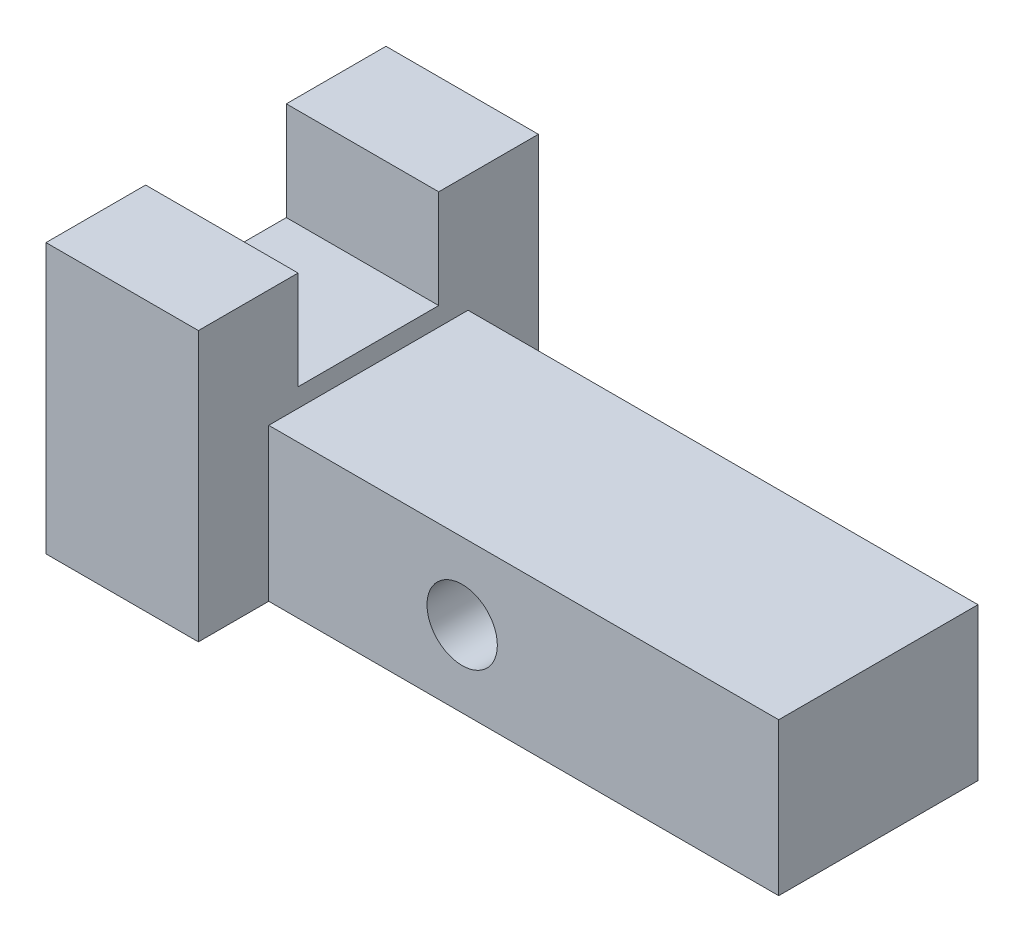
ISO-10303-21;
HEADER;
FILE_DESCRIPTION(('STEP AP214'),'2;1');
FILE_NAME('part.step','',(''),(''),'','','');
FILE_SCHEMA(('AUTOMOTIVE_DESIGN { 1 0 10303 214 1 1 1 1 }'));
ENDSEC;
DATA;
#1=APPLICATION_CONTEXT('core data for automotive mechanical design processes');
#2=APPLICATION_PROTOCOL_DEFINITION('international standard','automotive_design',2000,#1);
#3=PRODUCT_CONTEXT('',#1,'mechanical');
#4=PRODUCT('Part','Part','',(#3));
#5=PRODUCT_RELATED_PRODUCT_CATEGORY('part','',(#4));
#6=PRODUCT_DEFINITION_FORMATION('','',#4);
#7=PRODUCT_DEFINITION_CONTEXT('part definition',#1,'design');
#8=PRODUCT_DEFINITION('design','',#6,#7);
#9=PRODUCT_DEFINITION_SHAPE('','',#8);
#10=(LENGTH_UNIT() NAMED_UNIT(*) SI_UNIT(.MILLI.,.METRE.));
#11=(NAMED_UNIT(*) PLANE_ANGLE_UNIT() SI_UNIT($,.RADIAN.));
#12=(NAMED_UNIT(*) SI_UNIT($,.STERADIAN.) SOLID_ANGLE_UNIT());
#13=UNCERTAINTY_MEASURE_WITH_UNIT(LENGTH_MEASURE(1.E-05),#10,'distance_accuracy_value','');
#14=(GEOMETRIC_REPRESENTATION_CONTEXT(3) GLOBAL_UNCERTAINTY_ASSIGNED_CONTEXT((#13)) GLOBAL_UNIT_ASSIGNED_CONTEXT((#10,
#11,#12)) REPRESENTATION_CONTEXT('',''));
#15=CARTESIAN_POINT('',(0.,0.,0.));
#16=DIRECTION('',(0.,0.,1.));
#17=DIRECTION('',(1.,0.,0.));
#18=AXIS2_PLACEMENT_3D('',#15,#16,#17);
#19=CARTESIAN_POINT('',(26.,0.,0.));
#20=DIRECTION('',(1.,0.,0.));
#21=DIRECTION('',(0.,0.,-1.));
#22=AXIS2_PLACEMENT_3D('',#19,#20,#21);
#23=PLANE('',#22);
#24=DIRECTION('',(0.,0.,-1.));
#25=VECTOR('',#24,1.);
#26=CARTESIAN_POINT('',(26.,26.,17.));
#27=LINE('',#26,#25);
#28=CARTESIAN_POINT('',(26.,26.,17.));
#29=VERTEX_POINT('',#28);
#30=CARTESIAN_POINT('',(26.,26.,-17.));
#31=VERTEX_POINT('',#30);
#32=EDGE_CURVE('E204',#29,#31,#27,.T.);
#33=ORIENTED_EDGE('',*,*,#32,.T.);
#34=DIRECTION('',(0.,-1.,0.));
#35=VECTOR('',#34,1.);
#36=CARTESIAN_POINT('',(26.,0.,-17.));
#37=LINE('',#36,#35);
#38=CARTESIAN_POINT('',(26.,0.,-17.));
#39=VERTEX_POINT('',#38);
#40=EDGE_CURVE('E52',#31,#39,#37,.T.);
#41=ORIENTED_EDGE('',*,*,#40,.T.);
#42=DIRECTION('',(0.,0.,-1.));
#43=VECTOR('',#42,1.);
#44=CARTESIAN_POINT('',(26.,0.,29.));
#45=LINE('',#44,#43);
#46=CARTESIAN_POINT('',(26.,0.,-29.));
#47=VERTEX_POINT('',#46);
#48=EDGE_CURVE('E197',#39,#47,#45,.T.);
#49=ORIENTED_EDGE('',*,*,#48,.T.);
#50=DIRECTION('',(0.,1.,0.));
#51=VECTOR('',#50,1.);
#52=CARTESIAN_POINT('',(26.,0.,-29.));
#53=LINE('',#52,#51);
#54=CARTESIAN_POINT('',(26.,46.,-29.));
#55=VERTEX_POINT('',#54);
#56=EDGE_CURVE('E179',#47,#55,#53,.T.);
#57=ORIENTED_EDGE('',*,*,#56,.T.);
#58=DIRECTION('',(0.,0.,1.));
#59=VECTOR('',#58,1.);
#60=CARTESIAN_POINT('',(26.,46.,-29.));
#61=LINE('',#60,#59);
#62=CARTESIAN_POINT('',(26.,46.,-12.));
#63=VERTEX_POINT('',#62);
#64=EDGE_CURVE('E192',#55,#63,#61,.T.);
#65=ORIENTED_EDGE('',*,*,#64,.T.);
#66=DIRECTION('',(0.,-1.,0.));
#67=VECTOR('',#66,1.);
#68=CARTESIAN_POINT('',(26.,46.,-12.));
#69=LINE('',#68,#67);
#70=CARTESIAN_POINT('',(26.,29.192145019536,-12.));
#71=VERTEX_POINT('',#70);
#72=EDGE_CURVE('E126',#63,#71,#69,.T.);
#73=ORIENTED_EDGE('',*,*,#72,.T.);
#74=DIRECTION('',(0.,0.,1.));
#75=VECTOR('',#74,1.);
#76=CARTESIAN_POINT('',(26.,29.192145019536,-12.));
#77=LINE('',#76,#75);
#78=CARTESIAN_POINT('',(26.,29.192145019536,12.));
#79=VERTEX_POINT('',#78);
#80=EDGE_CURVE('E119',#71,#79,#77,.T.);
#81=ORIENTED_EDGE('',*,*,#80,.T.);
#82=DIRECTION('',(0.,1.,0.));
#83=VECTOR('',#82,1.);
#84=CARTESIAN_POINT('',(26.,29.192145019536,12.));
#85=LINE('',#84,#83);
#86=CARTESIAN_POINT('',(26.,46.,12.));
#87=VERTEX_POINT('',#86);
#88=EDGE_CURVE('E123',#79,#87,#85,.T.);
#89=ORIENTED_EDGE('',*,*,#88,.T.);
#90=DIRECTION('',(0.,0.,1.));
#91=VECTOR('',#90,1.);
#92=CARTESIAN_POINT('',(26.,46.,12.));
#93=LINE('',#92,#91);
#94=CARTESIAN_POINT('',(26.,46.,29.));
#95=VERTEX_POINT('',#94);
#96=EDGE_CURVE('E61',#87,#95,#93,.T.);
#97=ORIENTED_EDGE('',*,*,#96,.T.);
#98=DIRECTION('',(0.,-1.,0.));
#99=VECTOR('',#98,1.);
#100=CARTESIAN_POINT('',(26.,46.,29.));
#101=LINE('',#100,#99);
#102=CARTESIAN_POINT('',(26.,0.,29.));
#103=VERTEX_POINT('',#102);
#104=EDGE_CURVE('E163',#95,#103,#101,.T.);
#105=ORIENTED_EDGE('',*,*,#104,.T.);
#106=CARTESIAN_POINT('',(26.,0.,17.));
#107=VERTEX_POINT('',#106);
#108=EDGE_CURVE('E102',#103,#107,#45,.T.);
#109=ORIENTED_EDGE('',*,*,#108,.T.);
#110=DIRECTION('',(0.,-1.,0.));
#111=VECTOR('',#110,1.);
#112=CARTESIAN_POINT('',(26.,0.,17.));
#113=LINE('',#112,#111);
#114=EDGE_CURVE('E209',#29,#107,#113,.T.);
#115=ORIENTED_EDGE('',*,*,#114,.F.);
#116=EDGE_LOOP('',(#33,#41,#49,#57,#65,#73,#81,#89,#97,#105,#109,#115));
#117=FACE_BOUND('',#116,.T.);
#118=ADVANCED_FACE('F37',(#117),#23,.T.);
#119=CARTESIAN_POINT('',(26.,46.,29.));
#120=DIRECTION('',(0.,0.,-1.));
#121=DIRECTION('',(0.,1.,0.));
#122=AXIS2_PLACEMENT_3D('',#119,#120,#121);
#123=PLANE('',#122);
#124=DIRECTION('',(0.,-1.,0.));
#125=VECTOR('',#124,1.);
#126=CARTESIAN_POINT('',(0.,46.,29.));
#127=LINE('',#126,#125);
#128=CARTESIAN_POINT('',(0.,46.,29.));
#129=VERTEX_POINT('',#128);
#130=CARTESIAN_POINT('',(0.,0.,29.));
#131=VERTEX_POINT('',#130);
#132=EDGE_CURVE('E147',#129,#131,#127,.T.);
#133=ORIENTED_EDGE('',*,*,#132,.T.);
#134=DIRECTION('',(-1.,0.,0.));
#135=VECTOR('',#134,1.);
#136=CARTESIAN_POINT('',(26.,0.,29.));
#137=LINE('',#136,#135);
#138=EDGE_CURVE('E11',#103,#131,#137,.T.);
#139=ORIENTED_EDGE('',*,*,#138,.F.);
#140=ORIENTED_EDGE('',*,*,#104,.F.);
#141=DIRECTION('',(-1.,0.,0.));
#142=VECTOR('',#141,1.);
#143=CARTESIAN_POINT('',(26.,46.,29.));
#144=LINE('',#143,#142);
#145=EDGE_CURVE('E143',#95,#129,#144,.T.);
#146=ORIENTED_EDGE('',*,*,#145,.T.);
#147=EDGE_LOOP('',(#133,#139,#140,#146));
#148=FACE_BOUND('',#147,.T.);
#149=ADVANCED_FACE('F39',(#148),#123,.F.);
#150=CARTESIAN_POINT('',(26.,0.,29.));
#151=DIRECTION('',(0.,1.,0.));
#152=DIRECTION('',(0.,0.,1.));
#153=AXIS2_PLACEMENT_3D('',#150,#151,#152);
#154=PLANE('',#153);
#155=DIRECTION('',(0.,0.,-1.));
#156=VECTOR('',#155,1.);
#157=CARTESIAN_POINT('',(0.,0.,29.));
#158=LINE('',#157,#156);
#159=CARTESIAN_POINT('',(0.,0.,-29.));
#160=VERTEX_POINT('',#159);
#161=EDGE_CURVE('E150',#131,#160,#158,.T.);
#162=ORIENTED_EDGE('',*,*,#161,.T.);
#163=DIRECTION('',(-1.,0.,0.));
#164=VECTOR('',#163,1.);
#165=CARTESIAN_POINT('',(26.,0.,-29.));
#166=LINE('',#165,#164);
#167=EDGE_CURVE('E45',#47,#160,#166,.T.);
#168=ORIENTED_EDGE('',*,*,#167,.F.);
#169=ORIENTED_EDGE('',*,*,#48,.F.);
#170=DIRECTION('',(1.,0.,0.));
#171=VECTOR('',#170,1.);
#172=CARTESIAN_POINT('',(26.,0.,-17.));
#173=LINE('',#172,#171);
#174=CARTESIAN_POINT('',(113.,0.,-17.));
#175=VERTEX_POINT('',#174);
#176=EDGE_CURVE('E213',#39,#175,#173,.T.);
#177=ORIENTED_EDGE('',*,*,#176,.T.);
#178=DIRECTION('',(0.,0.,-1.));
#179=VECTOR('',#178,1.);
#180=CARTESIAN_POINT('',(113.,0.,17.));
#181=LINE('',#180,#179);
#182=CARTESIAN_POINT('',(113.,0.,17.));
#183=VERTEX_POINT('',#182);
#184=EDGE_CURVE('E151',#183,#175,#181,.T.);
#185=ORIENTED_EDGE('',*,*,#184,.F.);
#186=DIRECTION('',(1.,0.,0.));
#187=VECTOR('',#186,1.);
#188=CARTESIAN_POINT('',(26.,0.,17.));
#189=LINE('',#188,#187);
#190=EDGE_CURVE('E223',#107,#183,#189,.T.);
#191=ORIENTED_EDGE('',*,*,#190,.F.);
#192=ORIENTED_EDGE('',*,*,#108,.F.);
#193=ORIENTED_EDGE('',*,*,#138,.T.);
#194=EDGE_LOOP('',(#162,#168,#169,#177,#185,#191,#192,#193));
#195=FACE_BOUND('',#194,.T.);
#196=ADVANCED_FACE('F256',(#195),#154,.F.);
#197=CARTESIAN_POINT('',(26.,0.,-29.));
#198=DIRECTION('',(0.,0.,1.));
#199=DIRECTION('',(0.,-1.,0.));
#200=AXIS2_PLACEMENT_3D('',#197,#198,#199);
#201=PLANE('',#200);
#202=DIRECTION('',(0.,1.,0.));
#203=VECTOR('',#202,1.);
#204=CARTESIAN_POINT('',(0.,0.,-29.));
#205=LINE('',#204,#203);
#206=CARTESIAN_POINT('',(0.,46.,-29.));
#207=VERTEX_POINT('',#206);
#208=EDGE_CURVE('E153',#160,#207,#205,.T.);
#209=ORIENTED_EDGE('',*,*,#208,.T.);
#210=DIRECTION('',(-1.,0.,0.));
#211=VECTOR('',#210,1.);
#212=CARTESIAN_POINT('',(26.,46.,-29.));
#213=LINE('',#212,#211);
#214=EDGE_CURVE('E170',#55,#207,#213,.T.);
#215=ORIENTED_EDGE('',*,*,#214,.F.);
#216=ORIENTED_EDGE('',*,*,#56,.F.);
#217=ORIENTED_EDGE('',*,*,#167,.T.);
#218=EDGE_LOOP('',(#209,#215,#216,#217));
#219=FACE_BOUND('',#218,.T.);
#220=ADVANCED_FACE('F177',(#219),#201,.F.);
#221=CARTESIAN_POINT('',(26.,46.,-29.));
#222=DIRECTION('',(0.,-1.,0.));
#223=DIRECTION('',(0.,0.,-1.));
#224=AXIS2_PLACEMENT_3D('',#221,#222,#223);
#225=PLANE('',#224);
#226=DIRECTION('',(0.,0.,1.));
#227=VECTOR('',#226,1.);
#228=CARTESIAN_POINT('',(0.,46.,-29.));
#229=LINE('',#228,#227);
#230=CARTESIAN_POINT('',(0.,46.,-12.));
#231=VERTEX_POINT('',#230);
#232=EDGE_CURVE('E155',#207,#231,#229,.T.);
#233=ORIENTED_EDGE('',*,*,#232,.T.);
#234=DIRECTION('',(-1.,0.,0.));
#235=VECTOR('',#234,1.);
#236=CARTESIAN_POINT('',(26.,46.,-12.));
#237=LINE('',#236,#235);
#238=EDGE_CURVE('E167',#63,#231,#237,.T.);
#239=ORIENTED_EDGE('',*,*,#238,.F.);
#240=ORIENTED_EDGE('',*,*,#64,.F.);
#241=ORIENTED_EDGE('',*,*,#214,.T.);
#242=EDGE_LOOP('',(#233,#239,#240,#241));
#243=FACE_BOUND('',#242,.T.);
#244=ADVANCED_FACE('F188',(#243),#225,.F.);
#245=CARTESIAN_POINT('',(26.,46.,-12.));
#246=DIRECTION('',(0.,0.,-1.));
#247=DIRECTION('',(0.,1.,0.));
#248=AXIS2_PLACEMENT_3D('',#245,#246,#247);
#249=PLANE('',#248);
#250=DIRECTION('',(0.,-1.,0.));
#251=VECTOR('',#250,1.);
#252=CARTESIAN_POINT('',(0.,46.,-12.));
#253=LINE('',#252,#251);
#254=CARTESIAN_POINT('',(0.,29.192145019536,-12.));
#255=VERTEX_POINT('',#254);
#256=EDGE_CURVE('E157',#231,#255,#253,.T.);
#257=ORIENTED_EDGE('',*,*,#256,.T.);
#258=DIRECTION('',(-1.,0.,0.));
#259=VECTOR('',#258,1.);
#260=CARTESIAN_POINT('',(26.,29.192145019536,-12.));
#261=LINE('',#260,#259);
#262=EDGE_CURVE('E138',#71,#255,#261,.T.);
#263=ORIENTED_EDGE('',*,*,#262,.F.);
#264=ORIENTED_EDGE('',*,*,#72,.F.);
#265=ORIENTED_EDGE('',*,*,#238,.T.);
#266=EDGE_LOOP('',(#257,#263,#264,#265));
#267=FACE_BOUND('',#266,.T.);
#268=ADVANCED_FACE('F191',(#267),#249,.F.);
#269=CARTESIAN_POINT('',(26.,29.192145019536,-12.));
#270=DIRECTION('',(0.,-1.,0.));
#271=DIRECTION('',(0.,0.,-1.));
#272=AXIS2_PLACEMENT_3D('',#269,#270,#271);
#273=PLANE('',#272);
#274=DIRECTION('',(0.,0.,1.));
#275=VECTOR('',#274,1.);
#276=CARTESIAN_POINT('',(0.,29.192145019536,-12.));
#277=LINE('',#276,#275);
#278=CARTESIAN_POINT('',(0.,29.192145019536,12.));
#279=VERTEX_POINT('',#278);
#280=EDGE_CURVE('E135',#255,#279,#277,.T.);
#281=ORIENTED_EDGE('',*,*,#280,.T.);
#282=DIRECTION('',(-1.,0.,0.));
#283=VECTOR('',#282,1.);
#284=CARTESIAN_POINT('',(26.,29.192145019536,12.));
#285=LINE('',#284,#283);
#286=EDGE_CURVE('E132',#79,#279,#285,.T.);
#287=ORIENTED_EDGE('',*,*,#286,.F.);
#288=ORIENTED_EDGE('',*,*,#80,.F.);
#289=ORIENTED_EDGE('',*,*,#262,.T.);
#290=EDGE_LOOP('',(#281,#287,#288,#289));
#291=FACE_BOUND('',#290,.T.);
#292=ADVANCED_FACE('F133',(#291),#273,.F.);
#293=CARTESIAN_POINT('',(26.,29.192145019536,12.));
#294=DIRECTION('',(0.,0.,1.));
#295=DIRECTION('',(0.,-1.,0.));
#296=AXIS2_PLACEMENT_3D('',#293,#294,#295);
#297=PLANE('',#296);
#298=DIRECTION('',(0.,1.,0.));
#299=VECTOR('',#298,1.);
#300=CARTESIAN_POINT('',(0.,29.192145019536,12.));
#301=LINE('',#300,#299);
#302=CARTESIAN_POINT('',(0.,46.,12.));
#303=VERTEX_POINT('',#302);
#304=EDGE_CURVE('E160',#279,#303,#301,.T.);
#305=ORIENTED_EDGE('',*,*,#304,.T.);
#306=DIRECTION('',(-1.,0.,0.));
#307=VECTOR('',#306,1.);
#308=CARTESIAN_POINT('',(26.,46.,12.));
#309=LINE('',#308,#307);
#310=EDGE_CURVE('E139',#87,#303,#309,.T.);
#311=ORIENTED_EDGE('',*,*,#310,.F.);
#312=ORIENTED_EDGE('',*,*,#88,.F.);
#313=ORIENTED_EDGE('',*,*,#286,.T.);
#314=EDGE_LOOP('',(#305,#311,#312,#313));
#315=FACE_BOUND('',#314,.T.);
#316=ADVANCED_FACE('F141',(#315),#297,.F.);
#317=CARTESIAN_POINT('',(26.,46.,12.));
#318=DIRECTION('',(0.,-1.,0.));
#319=DIRECTION('',(0.,0.,-1.));
#320=AXIS2_PLACEMENT_3D('',#317,#318,#319);
#321=PLANE('',#320);
#322=DIRECTION('',(0.,0.,1.));
#323=VECTOR('',#322,1.);
#324=CARTESIAN_POINT('',(0.,46.,12.));
#325=LINE('',#324,#323);
#326=EDGE_CURVE('E94',#303,#129,#325,.T.);
#327=ORIENTED_EDGE('',*,*,#326,.T.);
#328=ORIENTED_EDGE('',*,*,#145,.F.);
#329=ORIENTED_EDGE('',*,*,#96,.F.);
#330=ORIENTED_EDGE('',*,*,#310,.T.);
#331=EDGE_LOOP('',(#327,#328,#329,#330));
#332=FACE_BOUND('',#331,.T.);
#333=ADVANCED_FACE('F248',(#332),#321,.F.);
#334=CARTESIAN_POINT('',(0.,0.,0.));
#335=DIRECTION('',(1.,0.,0.));
#336=DIRECTION('',(0.,0.,-1.));
#337=AXIS2_PLACEMENT_3D('',#334,#335,#336);
#338=PLANE('',#337);
#339=ORIENTED_EDGE('',*,*,#132,.F.);
#340=ORIENTED_EDGE('',*,*,#326,.F.);
#341=ORIENTED_EDGE('',*,*,#304,.F.);
#342=ORIENTED_EDGE('',*,*,#280,.F.);
#343=ORIENTED_EDGE('',*,*,#256,.F.);
#344=ORIENTED_EDGE('',*,*,#232,.F.);
#345=ORIENTED_EDGE('',*,*,#208,.F.);
#346=ORIENTED_EDGE('',*,*,#161,.F.);
#347=EDGE_LOOP('',(#339,#340,#341,#342,#343,#344,#345,#346));
#348=FACE_BOUND('',#347,.T.);
#349=ADVANCED_FACE('F184',(#348),#338,.F.);
#350=CARTESIAN_POINT('',(0.,0.,17.));
#351=DIRECTION('',(0.,0.,-1.));
#352=DIRECTION('',(-1.,0.,0.));
#353=AXIS2_PLACEMENT_3D('',#350,#351,#352);
#354=PLANE('',#353);
#355=ORIENTED_EDGE('',*,*,#114,.T.);
#356=ORIENTED_EDGE('',*,*,#190,.T.);
#357=DIRECTION('',(0.,1.,0.));
#358=VECTOR('',#357,1.);
#359=CARTESIAN_POINT('',(113.,0.,17.));
#360=LINE('',#359,#358);
#361=CARTESIAN_POINT('',(113.,26.,17.));
#362=VERTEX_POINT('',#361);
#363=EDGE_CURVE('E220',#183,#362,#360,.T.);
#364=ORIENTED_EDGE('',*,*,#363,.T.);
#365=DIRECTION('',(-1.,0.,0.));
#366=VECTOR('',#365,1.);
#367=CARTESIAN_POINT('',(26.,26.,17.));
#368=LINE('',#367,#366);
#369=EDGE_CURVE('E206',#362,#29,#368,.T.);
#370=ORIENTED_EDGE('',*,*,#369,.T.);
#371=EDGE_LOOP('',(#355,#356,#364,#370));
#372=FACE_BOUND('',#371,.T.);
#373=CARTESIAN_POINT('',(59.,13.,17.));
#374=DIRECTION('',(0.,0.,1.));
#375=DIRECTION('',(1.,0.,0.));
#376=AXIS2_PLACEMENT_3D('',#373,#374,#375);
#377=CIRCLE('',#376,6.);
#378=CARTESIAN_POINT('',(65.,13.,17.));
#379=VERTEX_POINT('',#378);
#380=EDGE_CURVE('E217',#379,#379,#377,.T.);
#381=ORIENTED_EDGE('',*,*,#380,.F.);
#382=EDGE_LOOP('',(#381));
#383=FACE_BOUND('',#382,.T.);
#384=ADVANCED_FACE('F237',(#372,#383),#354,.F.);
#385=CARTESIAN_POINT('',(0.,0.,-17.));
#386=DIRECTION('',(0.,0.,-1.));
#387=DIRECTION('',(-1.,0.,0.));
#388=AXIS2_PLACEMENT_3D('',#385,#386,#387);
#389=PLANE('',#388);
#390=ORIENTED_EDGE('',*,*,#40,.F.);
#391=DIRECTION('',(-1.,0.,0.));
#392=VECTOR('',#391,1.);
#393=CARTESIAN_POINT('',(26.,26.,-17.));
#394=LINE('',#393,#392);
#395=CARTESIAN_POINT('',(113.,26.,-17.));
#396=VERTEX_POINT('',#395);
#397=EDGE_CURVE('E207',#396,#31,#394,.T.);
#398=ORIENTED_EDGE('',*,*,#397,.F.);
#399=DIRECTION('',(0.,1.,0.));
#400=VECTOR('',#399,1.);
#401=CARTESIAN_POINT('',(113.,0.,-17.));
#402=LINE('',#401,#400);
#403=EDGE_CURVE('E210',#175,#396,#402,.T.);
#404=ORIENTED_EDGE('',*,*,#403,.F.);
#405=ORIENTED_EDGE('',*,*,#176,.F.);
#406=EDGE_LOOP('',(#390,#398,#404,#405));
#407=FACE_BOUND('',#406,.T.);
#408=CARTESIAN_POINT('',(59.,13.,-17.));
#409=DIRECTION('',(0.,0.,1.));
#410=DIRECTION('',(1.,0.,0.));
#411=AXIS2_PLACEMENT_3D('',#408,#409,#410);
#412=CIRCLE('',#411,6.);
#413=CARTESIAN_POINT('',(65.,13.,-17.));
#414=VERTEX_POINT('',#413);
#415=EDGE_CURVE('E228',#414,#414,#412,.T.);
#416=ORIENTED_EDGE('',*,*,#415,.T.);
#417=EDGE_LOOP('',(#416));
#418=FACE_BOUND('',#417,.T.);
#419=ADVANCED_FACE('F239',(#407,#418),#389,.T.);
#420=CARTESIAN_POINT('',(113.,0.,17.));
#421=DIRECTION('',(-1.,0.,0.));
#422=DIRECTION('',(0.,0.,1.));
#423=AXIS2_PLACEMENT_3D('',#420,#421,#422);
#424=PLANE('',#423);
#425=ORIENTED_EDGE('',*,*,#403,.T.);
#426=DIRECTION('',(0.,0.,-1.));
#427=VECTOR('',#426,1.);
#428=CARTESIAN_POINT('',(113.,26.,17.));
#429=LINE('',#428,#427);
#430=EDGE_CURVE('E201',#362,#396,#429,.T.);
#431=ORIENTED_EDGE('',*,*,#430,.F.);
#432=ORIENTED_EDGE('',*,*,#363,.F.);
#433=ORIENTED_EDGE('',*,*,#184,.T.);
#434=EDGE_LOOP('',(#425,#431,#432,#433));
#435=FACE_BOUND('',#434,.T.);
#436=ADVANCED_FACE('F246',(#435),#424,.F.);
#437=CARTESIAN_POINT('',(26.,26.,17.));
#438=DIRECTION('',(0.,-1.,0.));
#439=DIRECTION('',(0.,0.,-1.));
#440=AXIS2_PLACEMENT_3D('',#437,#438,#439);
#441=PLANE('',#440);
#442=ORIENTED_EDGE('',*,*,#397,.T.);
#443=ORIENTED_EDGE('',*,*,#32,.F.);
#444=ORIENTED_EDGE('',*,*,#369,.F.);
#445=ORIENTED_EDGE('',*,*,#430,.T.);
#446=EDGE_LOOP('',(#442,#443,#444,#445));
#447=FACE_BOUND('',#446,.T.);
#448=ADVANCED_FACE('F296',(#447),#441,.F.);
#449=CARTESIAN_POINT('',(59.,13.,17.));
#450=DIRECTION('',(0.,0.,-1.));
#451=DIRECTION('',(-1.,0.,0.));
#452=AXIS2_PLACEMENT_3D('',#449,#450,#451);
#453=CYLINDRICAL_SURFACE('',#452,6.);
#454=ORIENTED_EDGE('',*,*,#380,.T.);
#455=EDGE_LOOP('',(#454));
#456=FACE_BOUND('',#455,.T.);
#457=ORIENTED_EDGE('',*,*,#415,.F.);
#458=EDGE_LOOP('',(#457));
#459=FACE_BOUND('',#458,.T.);
#460=ADVANCED_FACE('F234',(#456,#459),#453,.F.);
#461=CLOSED_SHELL('',(#118,#149,#196,#220,#244,#268,#292,#316,#333,#349,#384,#419,#436,#448,#460));
#462=MANIFOLD_SOLID_BREP('B2',#461);
#463=ADVANCED_BREP_SHAPE_REPRESENTATION('',(#18,#462),#14);
#464=SHAPE_DEFINITION_REPRESENTATION(#9,#463);
ENDSEC;
END-ISO-10303-21;
